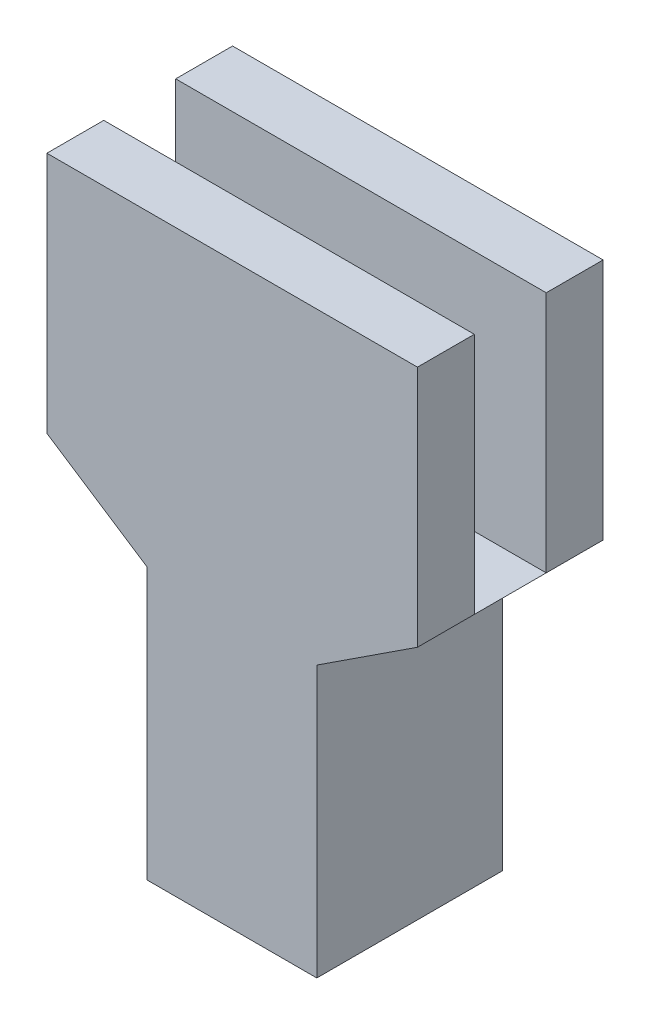
ISO-10303-21;
HEADER;
FILE_DESCRIPTION(('STEP AP214'),'2;1');
FILE_NAME('part.step','',(''),(''),'','','');
FILE_SCHEMA(('AUTOMOTIVE_DESIGN { 1 0 10303 214 1 1 1 1 }'));
ENDSEC;
DATA;
#1=APPLICATION_CONTEXT('core data for automotive mechanical design processes');
#2=APPLICATION_PROTOCOL_DEFINITION('international standard','automotive_design',2000,#1);
#3=PRODUCT_CONTEXT('',#1,'mechanical');
#4=PRODUCT('Part','Part','',(#3));
#5=PRODUCT_RELATED_PRODUCT_CATEGORY('part','',(#4));
#6=PRODUCT_DEFINITION_FORMATION('','',#4);
#7=PRODUCT_DEFINITION_CONTEXT('part definition',#1,'design');
#8=PRODUCT_DEFINITION('design','',#6,#7);
#9=PRODUCT_DEFINITION_SHAPE('','',#8);
#10=(LENGTH_UNIT() NAMED_UNIT(*) SI_UNIT(.MILLI.,.METRE.));
#11=(NAMED_UNIT(*) PLANE_ANGLE_UNIT() SI_UNIT($,.RADIAN.));
#12=(NAMED_UNIT(*) SI_UNIT($,.STERADIAN.) SOLID_ANGLE_UNIT());
#13=UNCERTAINTY_MEASURE_WITH_UNIT(LENGTH_MEASURE(1.E-05),#10,'distance_accuracy_value','');
#14=(GEOMETRIC_REPRESENTATION_CONTEXT(3) GLOBAL_UNCERTAINTY_ASSIGNED_CONTEXT((#13)) GLOBAL_UNIT_ASSIGNED_CONTEXT((#10,
#11,#12)) REPRESENTATION_CONTEXT('',''));
#15=CARTESIAN_POINT('',(0.,0.,0.));
#16=DIRECTION('',(0.,0.,1.));
#17=DIRECTION('',(1.,0.,0.));
#18=AXIS2_PLACEMENT_3D('',#15,#16,#17);
#19=CARTESIAN_POINT('',(49.8924699404346,106.450623348882,50.));
#20=DIRECTION('',(-1.,0.,0.));
#21=DIRECTION('',(0.,-1.,0.));
#22=AXIS2_PLACEMENT_3D('',#19,#20,#21);
#23=PLANE('',#22);
#24=DIRECTION('',(0.,0.,-1.));
#25=VECTOR('',#24,1.);
#26=CARTESIAN_POINT('',(49.8924699404346,41.1226560450599,50.));
#27=LINE('',#26,#25);
#28=CARTESIAN_POINT('',(49.8924699404346,41.1226560450599,50.));
#29=VERTEX_POINT('',#28);
#30=CARTESIAN_POINT('',(49.8924699404346,41.12265604506,34.6825403750302));
#31=VERTEX_POINT('',#30);
#32=EDGE_CURVE('E169',#29,#31,#27,.T.);
#33=ORIENTED_EDGE('',*,*,#32,.T.);
#34=DIRECTION('',(0.,1.,0.));
#35=VECTOR('',#34,1.);
#36=CARTESIAN_POINT('',(49.8924699404346,188.280019043169,34.6825403750302));
#37=LINE('',#36,#35);
#38=CARTESIAN_POINT('',(49.8924699404346,106.450623348882,34.6825403750302));
#39=VERTEX_POINT('',#38);
#40=EDGE_CURVE('E130',#31,#39,#37,.T.);
#41=ORIENTED_EDGE('',*,*,#40,.T.);
#42=DIRECTION('',(0.,0.,-1.));
#43=VECTOR('',#42,1.);
#44=CARTESIAN_POINT('',(49.8924699404346,106.450623348882,50.));
#45=LINE('',#44,#43);
#46=CARTESIAN_POINT('',(49.8924699404346,106.450623348882,50.));
#47=VERTEX_POINT('',#46);
#48=EDGE_CURVE('E128',#47,#39,#45,.T.);
#49=ORIENTED_EDGE('',*,*,#48,.F.);
#50=DIRECTION('',(0.,1.,0.));
#51=VECTOR('',#50,1.);
#52=CARTESIAN_POINT('',(49.8924699404346,106.450623348882,50.));
#53=LINE('',#52,#51);
#54=EDGE_CURVE('E114',#29,#47,#53,.T.);
#55=ORIENTED_EDGE('',*,*,#54,.F.);
#56=EDGE_LOOP('',(#33,#41,#49,#55));
#57=FACE_BOUND('',#56,.T.);
#58=ADVANCED_FACE('F33',(#57),#23,.F.);
#59=CARTESIAN_POINT('',(-49.8924699404346,106.450623348882,50.));
#60=DIRECTION('',(0.,-1.,0.));
#61=DIRECTION('',(1.,0.,0.));
#62=AXIS2_PLACEMENT_3D('',#59,#60,#61);
#63=PLANE('',#62);
#64=ORIENTED_EDGE('',*,*,#48,.T.);
#65=DIRECTION('',(-1.,0.,0.));
#66=VECTOR('',#65,1.);
#67=CARTESIAN_POINT('',(-49.8924699404346,106.450623348882,34.6825403750302));
#68=LINE('',#67,#66);
#69=CARTESIAN_POINT('',(-49.8924699404346,106.450623348882,34.6825403750302));
#70=VERTEX_POINT('',#69);
#71=EDGE_CURVE('E208',#39,#70,#68,.T.);
#72=ORIENTED_EDGE('',*,*,#71,.T.);
#73=DIRECTION('',(0.,0.,-1.));
#74=VECTOR('',#73,1.);
#75=CARTESIAN_POINT('',(-49.8924699404346,106.450623348882,50.));
#76=LINE('',#75,#74);
#77=CARTESIAN_POINT('',(-49.8924699404346,106.450623348882,50.));
#78=VERTEX_POINT('',#77);
#79=EDGE_CURVE('E138',#78,#70,#76,.T.);
#80=ORIENTED_EDGE('',*,*,#79,.F.);
#81=DIRECTION('',(-1.,0.,0.));
#82=VECTOR('',#81,1.);
#83=CARTESIAN_POINT('',(-49.8924699404346,106.450623348882,50.));
#84=LINE('',#83,#82);
#85=EDGE_CURVE('E118',#47,#78,#84,.T.);
#86=ORIENTED_EDGE('',*,*,#85,.F.);
#87=EDGE_LOOP('',(#64,#72,#80,#86));
#88=FACE_BOUND('',#87,.T.);
#89=ADVANCED_FACE('F136',(#88),#63,.F.);
#90=CARTESIAN_POINT('',(-49.8924699404346,106.450623348882,50.));
#91=DIRECTION('',(1.,0.,0.));
#92=DIRECTION('',(0.,1.,0.));
#93=AXIS2_PLACEMENT_3D('',#90,#91,#92);
#94=PLANE('',#93);
#95=ORIENTED_EDGE('',*,*,#79,.T.);
#96=DIRECTION('',(0.,1.,0.));
#97=VECTOR('',#96,1.);
#98=CARTESIAN_POINT('',(-49.8924699404346,188.280019043169,34.6825403750302));
#99=LINE('',#98,#97);
#100=CARTESIAN_POINT('',(-49.8924699404346,41.1226560450599,34.6825403750302));
#101=VERTEX_POINT('',#100);
#102=EDGE_CURVE('E223',#101,#70,#99,.T.);
#103=ORIENTED_EDGE('',*,*,#102,.F.);
#104=DIRECTION('',(0.,0.,-1.));
#105=VECTOR('',#104,1.);
#106=CARTESIAN_POINT('',(-49.8924699404346,41.1226560450599,50.));
#107=LINE('',#106,#105);
#108=CARTESIAN_POINT('',(-49.8924699404346,41.1226560450599,50.));
#109=VERTEX_POINT('',#108);
#110=EDGE_CURVE('E164',#109,#101,#107,.T.);
#111=ORIENTED_EDGE('',*,*,#110,.F.);
#112=DIRECTION('',(0.,-1.,0.));
#113=VECTOR('',#112,1.);
#114=CARTESIAN_POINT('',(-49.8924699404346,106.450623348882,50.));
#115=LINE('',#114,#113);
#116=EDGE_CURVE('E56',#78,#109,#115,.T.);
#117=ORIENTED_EDGE('',*,*,#116,.F.);
#118=EDGE_LOOP('',(#95,#103,#111,#117));
#119=FACE_BOUND('',#118,.T.);
#120=ADVANCED_FACE('F262',(#119),#94,.F.);
#121=CARTESIAN_POINT('',(-49.8924699404346,41.1226560450599,50.));
#122=DIRECTION('',(0.548213568553886,0.836338378441055,0.));
#123=DIRECTION('',(-0.836338378441055,0.548213568553887,0.));
#124=AXIS2_PLACEMENT_3D('',#121,#122,#123);
#125=PLANE('',#124);
#126=DIRECTION('',(0.836338378441055,-0.548213568553887,0.));
#127=VECTOR('',#126,1.);
#128=CARTESIAN_POINT('',(-49.8924699404346,41.1226560450599,0.));
#129=LINE('',#128,#127);
#130=CARTESIAN_POINT('',(-49.8924699404346,41.1226560450599,0.));
#131=VERTEX_POINT('',#130);
#132=CARTESIAN_POINT('',(-22.9108785051738,23.436424123527,0.));
#133=VERTEX_POINT('',#132);
#134=EDGE_CURVE('E143',#131,#133,#129,.T.);
#135=ORIENTED_EDGE('',*,*,#134,.T.);
#136=DIRECTION('',(0.,0.,-1.));
#137=VECTOR('',#136,1.);
#138=CARTESIAN_POINT('',(-22.9108785051738,23.436424123527,50.));
#139=LINE('',#138,#137);
#140=CARTESIAN_POINT('',(-22.9108785051738,23.436424123527,50.));
#141=VERTEX_POINT('',#140);
#142=EDGE_CURVE('E41',#141,#133,#139,.T.);
#143=ORIENTED_EDGE('',*,*,#142,.F.);
#144=DIRECTION('',(0.836338378441055,-0.548213568553887,0.));
#145=VECTOR('',#144,1.);
#146=CARTESIAN_POINT('',(-49.8924699404346,41.1226560450599,50.));
#147=LINE('',#146,#145);
#148=EDGE_CURVE('E163',#109,#141,#147,.T.);
#149=ORIENTED_EDGE('',*,*,#148,.F.);
#150=ORIENTED_EDGE('',*,*,#110,.T.);
#151=DIRECTION('',(0.,0.,1.));
#152=VECTOR('',#151,1.);
#153=CARTESIAN_POINT('',(-49.8924699404346,41.1226560450599,15.3174596249698));
#154=LINE('',#153,#152);
#155=CARTESIAN_POINT('',(-49.8924699404346,41.1226560450599,15.3174596249698));
#156=VERTEX_POINT('',#155);
#157=EDGE_CURVE('E220',#156,#101,#154,.T.);
#158=ORIENTED_EDGE('',*,*,#157,.F.);
#159=EDGE_CURVE('E90',#156,#131,#107,.T.);
#160=ORIENTED_EDGE('',*,*,#159,.T.);
#161=EDGE_LOOP('',(#135,#143,#149,#150,#158,#160));
#162=FACE_BOUND('',#161,.T.);
#163=ADVANCED_FACE('F35',(#162),#125,.F.);
#164=CARTESIAN_POINT('',(-22.9108785051738,23.436424123527,50.));
#165=DIRECTION('',(1.,0.,0.));
#166=DIRECTION('',(0.,1.,0.));
#167=AXIS2_PLACEMENT_3D('',#164,#165,#166);
#168=PLANE('',#167);
#169=DIRECTION('',(0.,-1.,0.));
#170=VECTOR('',#169,1.);
#171=CARTESIAN_POINT('',(-22.9108785051738,23.436424123527,0.));
#172=LINE('',#171,#170);
#173=CARTESIAN_POINT('',(-22.9108785051738,-49.5635692266299,0.));
#174=VERTEX_POINT('',#173);
#175=EDGE_CURVE('E145',#133,#174,#172,.T.);
#176=ORIENTED_EDGE('',*,*,#175,.T.);
#177=DIRECTION('',(0.,0.,-1.));
#178=VECTOR('',#177,1.);
#179=CARTESIAN_POINT('',(-22.9108785051738,-49.5635692266299,50.));
#180=LINE('',#179,#178);
#181=CARTESIAN_POINT('',(-22.9108785051738,-49.5635692266299,50.));
#182=VERTEX_POINT('',#181);
#183=EDGE_CURVE('E177',#182,#174,#180,.T.);
#184=ORIENTED_EDGE('',*,*,#183,.F.);
#185=DIRECTION('',(0.,-1.,0.));
#186=VECTOR('',#185,1.);
#187=CARTESIAN_POINT('',(-22.9108785051738,23.436424123527,50.));
#188=LINE('',#187,#186);
#189=EDGE_CURVE('E99',#141,#182,#188,.T.);
#190=ORIENTED_EDGE('',*,*,#189,.F.);
#191=ORIENTED_EDGE('',*,*,#142,.T.);
#192=EDGE_LOOP('',(#176,#184,#190,#191));
#193=FACE_BOUND('',#192,.T.);
#194=ADVANCED_FACE('F180',(#193),#168,.F.);
#195=CARTESIAN_POINT('',(-22.9108785051738,-49.5635692266299,50.));
#196=DIRECTION('',(0.,1.,0.));
#197=DIRECTION('',(0.,0.,1.));
#198=AXIS2_PLACEMENT_3D('',#195,#196,#197);
#199=PLANE('',#198);
#200=CARTESIAN_POINT('',(0.,-49.5635692266299,25.));
#201=DIRECTION('',(0.,-1.,0.));
#202=DIRECTION('',(0.,0.,-1.));
#203=AXIS2_PLACEMENT_3D('',#200,#201,#202);
#204=CIRCLE('',#203,5.);
#205=CARTESIAN_POINT('',(0.,-49.5635692266299,20.));
#206=VERTEX_POINT('',#205);
#207=EDGE_CURVE('E205',#206,#206,#204,.T.);
#208=ORIENTED_EDGE('',*,*,#207,.F.);
#209=EDGE_LOOP('',(#208));
#210=FACE_BOUND('',#209,.T.);
#211=DIRECTION('',(1.,0.,0.));
#212=VECTOR('',#211,1.);
#213=CARTESIAN_POINT('',(-22.9108785051738,-49.5635692266299,0.));
#214=LINE('',#213,#212);
#215=CARTESIAN_POINT('',(22.7929745442098,-49.5635692266299,0.));
#216=VERTEX_POINT('',#215);
#217=EDGE_CURVE('E148',#174,#216,#214,.T.);
#218=ORIENTED_EDGE('',*,*,#217,.T.);
#219=DIRECTION('',(0.,0.,-1.));
#220=VECTOR('',#219,1.);
#221=CARTESIAN_POINT('',(22.7929745442098,-49.5635692266299,50.));
#222=LINE('',#221,#220);
#223=CARTESIAN_POINT('',(22.7929745442098,-49.5635692266299,50.));
#224=VERTEX_POINT('',#223);
#225=EDGE_CURVE('E174',#224,#216,#222,.T.);
#226=ORIENTED_EDGE('',*,*,#225,.F.);
#227=DIRECTION('',(1.,0.,0.));
#228=VECTOR('',#227,1.);
#229=CARTESIAN_POINT('',(-22.9108785051738,-49.5635692266299,50.));
#230=LINE('',#229,#228);
#231=EDGE_CURVE('E199',#182,#224,#230,.T.);
#232=ORIENTED_EDGE('',*,*,#231,.F.);
#233=ORIENTED_EDGE('',*,*,#183,.T.);
#234=EDGE_LOOP('',(#218,#226,#232,#233));
#235=FACE_BOUND('',#234,.T.);
#236=ADVANCED_FACE('F192',(#210,#235),#199,.F.);
#237=CARTESIAN_POINT('',(22.824133964806,23.4364241233047,50.));
#238=DIRECTION('',(-0.999999908903215,0.000426841378029894,0.));
#239=DIRECTION('',(-0.000426841378029894,-0.999999908903215,0.));
#240=AXIS2_PLACEMENT_3D('',#237,#238,#239);
#241=PLANE('',#240);
#242=DIRECTION('',(0.000426841378029894,0.999999908903215,0.));
#243=VECTOR('',#242,1.);
#244=CARTESIAN_POINT('',(22.824133964806,23.4364241233047,0.));
#245=LINE('',#244,#243);
#246=CARTESIAN_POINT('',(22.824133964806,23.4364241233047,0.));
#247=VERTEX_POINT('',#246);
#248=EDGE_CURVE('E150',#216,#247,#245,.T.);
#249=ORIENTED_EDGE('',*,*,#248,.T.);
#250=DIRECTION('',(0.,0.,-1.));
#251=VECTOR('',#250,1.);
#252=CARTESIAN_POINT('',(22.824133964806,23.4364241233047,50.));
#253=LINE('',#252,#251);
#254=CARTESIAN_POINT('',(22.824133964806,23.4364241233047,50.));
#255=VERTEX_POINT('',#254);
#256=EDGE_CURVE('E171',#255,#247,#253,.T.);
#257=ORIENTED_EDGE('',*,*,#256,.F.);
#258=DIRECTION('',(0.000426841378029894,0.999999908903215,0.));
#259=VECTOR('',#258,1.);
#260=CARTESIAN_POINT('',(22.824133964806,23.4364241233047,50.));
#261=LINE('',#260,#259);
#262=EDGE_CURVE('E198',#224,#255,#261,.T.);
#263=ORIENTED_EDGE('',*,*,#262,.F.);
#264=ORIENTED_EDGE('',*,*,#225,.T.);
#265=EDGE_LOOP('',(#249,#257,#263,#264));
#266=FACE_BOUND('',#265,.T.);
#267=ADVANCED_FACE('F196',(#266),#241,.F.);
#268=CARTESIAN_POINT('',(49.8924699404346,41.1226560450599,50.));
#269=DIRECTION('',(-0.54698295491962,0.837143743348418,0.));
#270=DIRECTION('',(-0.837143743348418,-0.54698295491962,0.));
#271=AXIS2_PLACEMENT_3D('',#268,#269,#270);
#272=PLANE('',#271);
#273=DIRECTION('',(0.837143743348418,0.54698295491962,0.));
#274=VECTOR('',#273,1.);
#275=CARTESIAN_POINT('',(49.8924699404346,41.1226560450599,0.));
#276=LINE('',#275,#274);
#277=CARTESIAN_POINT('',(49.8924699404346,41.1226560450599,0.));
#278=VERTEX_POINT('',#277);
#279=EDGE_CURVE('E152',#247,#278,#276,.T.);
#280=ORIENTED_EDGE('',*,*,#279,.T.);
#281=CARTESIAN_POINT('',(49.8924699404346,41.12265604506,15.3174596249698));
#282=VERTEX_POINT('',#281);
#283=EDGE_CURVE('E133',#282,#278,#27,.T.);
#284=ORIENTED_EDGE('',*,*,#283,.F.);
#285=DIRECTION('',(0.,0.,1.));
#286=VECTOR('',#285,1.);
#287=CARTESIAN_POINT('',(49.8924699404346,41.12265604506,15.3174596249698));
#288=LINE('',#287,#286);
#289=EDGE_CURVE('E217',#282,#31,#288,.T.);
#290=ORIENTED_EDGE('',*,*,#289,.T.);
#291=ORIENTED_EDGE('',*,*,#32,.F.);
#292=DIRECTION('',(0.837143743348418,0.54698295491962,0.));
#293=VECTOR('',#292,1.);
#294=CARTESIAN_POINT('',(49.8924699404346,41.1226560450599,50.));
#295=LINE('',#294,#293);
#296=EDGE_CURVE('E121',#255,#29,#295,.T.);
#297=ORIENTED_EDGE('',*,*,#296,.F.);
#298=ORIENTED_EDGE('',*,*,#256,.T.);
#299=EDGE_LOOP('',(#280,#284,#290,#291,#297,#298));
#300=FACE_BOUND('',#299,.T.);
#301=ADVANCED_FACE('F242',(#300),#272,.F.);
#302=CARTESIAN_POINT('',(49.8924699404346,106.450623348882,15.3174596249698));
#303=VERTEX_POINT('',#302);
#304=CARTESIAN_POINT('',(49.8924699404346,106.450623348882,0.));
#305=VERTEX_POINT('',#304);
#306=EDGE_CURVE('E134',#303,#305,#45,.T.);
#307=ORIENTED_EDGE('',*,*,#306,.F.);
#308=DIRECTION('',(0.,-1.,0.));
#309=VECTOR('',#308,1.);
#310=CARTESIAN_POINT('',(49.8924699404346,188.280019043169,15.3174596249698));
#311=LINE('',#310,#309);
#312=EDGE_CURVE('E228',#303,#282,#311,.T.);
#313=ORIENTED_EDGE('',*,*,#312,.T.);
#314=ORIENTED_EDGE('',*,*,#283,.T.);
#315=DIRECTION('',(0.,1.,0.));
#316=VECTOR('',#315,1.);
#317=CARTESIAN_POINT('',(49.8924699404346,106.450623348882,0.));
#318=LINE('',#317,#316);
#319=EDGE_CURVE('E155',#278,#305,#318,.T.);
#320=ORIENTED_EDGE('',*,*,#319,.T.);
#321=EDGE_LOOP('',(#307,#313,#314,#320));
#322=FACE_BOUND('',#321,.T.);
#323=ADVANCED_FACE('F235',(#322),#23,.F.);
#324=CARTESIAN_POINT('',(-49.8924699404346,106.450623348882,15.3174596249698));
#325=VERTEX_POINT('',#324);
#326=CARTESIAN_POINT('',(-49.8924699404346,106.450623348882,0.));
#327=VERTEX_POINT('',#326);
#328=EDGE_CURVE('E167',#325,#327,#76,.T.);
#329=ORIENTED_EDGE('',*,*,#328,.F.);
#330=DIRECTION('',(1.,0.,0.));
#331=VECTOR('',#330,1.);
#332=CARTESIAN_POINT('',(-49.8924699404346,106.450623348882,15.3174596249698));
#333=LINE('',#332,#331);
#334=EDGE_CURVE('E48',#325,#303,#333,.T.);
#335=ORIENTED_EDGE('',*,*,#334,.T.);
#336=ORIENTED_EDGE('',*,*,#306,.T.);
#337=DIRECTION('',(-1.,0.,0.));
#338=VECTOR('',#337,1.);
#339=CARTESIAN_POINT('',(-49.8924699404346,106.450623348882,0.));
#340=LINE('',#339,#338);
#341=EDGE_CURVE('E158',#305,#327,#340,.T.);
#342=ORIENTED_EDGE('',*,*,#341,.T.);
#343=EDGE_LOOP('',(#329,#335,#336,#342));
#344=FACE_BOUND('',#343,.T.);
#345=ADVANCED_FACE('F247',(#344),#63,.F.);
#346=ORIENTED_EDGE('',*,*,#159,.F.);
#347=DIRECTION('',(0.,1.,0.));
#348=VECTOR('',#347,1.);
#349=CARTESIAN_POINT('',(-49.8924699404346,106.450623348882,15.3174596249698));
#350=LINE('',#349,#348);
#351=EDGE_CURVE('E11',#156,#325,#350,.T.);
#352=ORIENTED_EDGE('',*,*,#351,.T.);
#353=ORIENTED_EDGE('',*,*,#328,.T.);
#354=DIRECTION('',(0.,-1.,0.));
#355=VECTOR('',#354,1.);
#356=CARTESIAN_POINT('',(-49.8924699404346,106.450623348882,0.));
#357=LINE('',#356,#355);
#358=EDGE_CURVE('E161',#327,#131,#357,.T.);
#359=ORIENTED_EDGE('',*,*,#358,.T.);
#360=EDGE_LOOP('',(#346,#352,#353,#359));
#361=FACE_BOUND('',#360,.T.);
#362=ADVANCED_FACE('F260',(#361),#94,.F.);
#363=CARTESIAN_POINT('',(-0.0800722510311269,8.47100092618879,50.));
#364=DIRECTION('',(0.,0.,-1.));
#365=DIRECTION('',(-1.,0.,0.));
#366=AXIS2_PLACEMENT_3D('',#363,#364,#365);
#367=PLANE('',#366);
#368=ORIENTED_EDGE('',*,*,#148,.T.);
#369=ORIENTED_EDGE('',*,*,#189,.T.);
#370=ORIENTED_EDGE('',*,*,#231,.T.);
#371=ORIENTED_EDGE('',*,*,#262,.T.);
#372=ORIENTED_EDGE('',*,*,#296,.T.);
#373=ORIENTED_EDGE('',*,*,#54,.T.);
#374=ORIENTED_EDGE('',*,*,#85,.T.);
#375=ORIENTED_EDGE('',*,*,#116,.T.);
#376=EDGE_LOOP('',(#368,#369,#370,#371,#372,#373,#374,#375));
#377=FACE_BOUND('',#376,.T.);
#378=ADVANCED_FACE('F116',(#377),#367,.F.);
#379=CARTESIAN_POINT('',(-0.0800722510311269,8.47100092618879,0.));
#380=DIRECTION('',(0.,0.,-1.));
#381=DIRECTION('',(-1.,0.,0.));
#382=AXIS2_PLACEMENT_3D('',#379,#380,#381);
#383=PLANE('',#382);
#384=ORIENTED_EDGE('',*,*,#134,.F.);
#385=ORIENTED_EDGE('',*,*,#358,.F.);
#386=ORIENTED_EDGE('',*,*,#341,.F.);
#387=ORIENTED_EDGE('',*,*,#319,.F.);
#388=ORIENTED_EDGE('',*,*,#279,.F.);
#389=ORIENTED_EDGE('',*,*,#248,.F.);
#390=ORIENTED_EDGE('',*,*,#217,.F.);
#391=ORIENTED_EDGE('',*,*,#175,.F.);
#392=EDGE_LOOP('',(#384,#385,#386,#387,#388,#389,#390,#391));
#393=FACE_BOUND('',#392,.T.);
#394=ADVANCED_FACE('F185',(#393),#383,.T.);
#395=CARTESIAN_POINT('',(0.,-29.5635692266299,25.));
#396=DIRECTION('',(0.,-1.,0.));
#397=DIRECTION('',(0.,0.,-1.));
#398=AXIS2_PLACEMENT_3D('',#395,#396,#397);
#399=CYLINDRICAL_SURFACE('',#398,5.);
#400=CARTESIAN_POINT('',(0.,-29.5635692266299,25.));
#401=DIRECTION('',(0.,-1.,0.));
#402=DIRECTION('',(0.,0.,-1.));
#403=AXIS2_PLACEMENT_3D('',#400,#401,#402);
#404=CIRCLE('',#403,5.);
#405=CARTESIAN_POINT('',(0.,-29.5635692266299,20.));
#406=VERTEX_POINT('',#405);
#407=EDGE_CURVE('E146',#406,#406,#404,.T.);
#408=ORIENTED_EDGE('',*,*,#407,.F.);
#409=EDGE_LOOP('',(#408));
#410=FACE_BOUND('',#409,.T.);
#411=ORIENTED_EDGE('',*,*,#207,.T.);
#412=EDGE_LOOP('',(#411));
#413=FACE_BOUND('',#412,.T.);
#414=ADVANCED_FACE('F274',(#410,#413),#399,.F.);
#415=CARTESIAN_POINT('',(0.,-29.5635692266299,25.));
#416=DIRECTION('',(0.,-1.,0.));
#417=DIRECTION('',(0.,0.,-1.));
#418=AXIS2_PLACEMENT_3D('',#415,#416,#417);
#419=PLANE('',#418);
#420=ORIENTED_EDGE('',*,*,#407,.T.);
#421=EDGE_LOOP('',(#420));
#422=FACE_BOUND('',#421,.T.);
#423=ADVANCED_FACE('F267',(#422),#419,.T.);
#424=CARTESIAN_POINT('',(49.8924699404346,188.280019043169,34.6825403750302));
#425=DIRECTION('',(0.,0.,1.));
#426=DIRECTION('',(1.,0.,0.));
#427=AXIS2_PLACEMENT_3D('',#424,#425,#426);
#428=PLANE('',#427);
#429=ORIENTED_EDGE('',*,*,#40,.F.);
#430=DIRECTION('',(-1.,0.,0.));
#431=VECTOR('',#430,1.);
#432=CARTESIAN_POINT('',(49.8924699404346,41.12265604506,34.6825403750302));
#433=LINE('',#432,#431);
#434=EDGE_CURVE('E213',#31,#101,#433,.T.);
#435=ORIENTED_EDGE('',*,*,#434,.T.);
#436=ORIENTED_EDGE('',*,*,#102,.T.);
#437=ORIENTED_EDGE('',*,*,#71,.F.);
#438=EDGE_LOOP('',(#429,#435,#436,#437));
#439=FACE_BOUND('',#438,.T.);
#440=ADVANCED_FACE('F265',(#439),#428,.F.);
#441=CARTESIAN_POINT('',(49.8924699404346,188.280019043169,15.3174596249698));
#442=DIRECTION('',(0.,0.,-1.));
#443=DIRECTION('',(-1.,0.,0.));
#444=AXIS2_PLACEMENT_3D('',#441,#442,#443);
#445=PLANE('',#444);
#446=ORIENTED_EDGE('',*,*,#351,.F.);
#447=DIRECTION('',(-1.,0.,0.));
#448=VECTOR('',#447,1.);
#449=CARTESIAN_POINT('',(49.8924699404346,41.12265604506,15.3174596249698));
#450=LINE('',#449,#448);
#451=EDGE_CURVE('E214',#282,#156,#450,.T.);
#452=ORIENTED_EDGE('',*,*,#451,.F.);
#453=ORIENTED_EDGE('',*,*,#312,.F.);
#454=ORIENTED_EDGE('',*,*,#334,.F.);
#455=EDGE_LOOP('',(#446,#452,#453,#454));
#456=FACE_BOUND('',#455,.T.);
#457=ADVANCED_FACE('F255',(#456),#445,.F.);
#458=CARTESIAN_POINT('',(49.8924699404346,41.12265604506,15.3174596249698));
#459=DIRECTION('',(0.,-1.,0.));
#460=DIRECTION('',(1.,0.,0.));
#461=AXIS2_PLACEMENT_3D('',#458,#459,#460);
#462=PLANE('',#461);
#463=ORIENTED_EDGE('',*,*,#157,.T.);
#464=ORIENTED_EDGE('',*,*,#434,.F.);
#465=ORIENTED_EDGE('',*,*,#289,.F.);
#466=ORIENTED_EDGE('',*,*,#451,.T.);
#467=EDGE_LOOP('',(#463,#464,#465,#466));
#468=FACE_BOUND('',#467,.T.);
#469=ADVANCED_FACE('F258',(#468),#462,.F.);
#470=CLOSED_SHELL('',(#58,#89,#120,#163,#194,#236,#267,#301,#323,#345,#362,#378,#394,#414,#423,
#440,#457,#469));
#471=MANIFOLD_SOLID_BREP('B2',#470);
#472=ADVANCED_BREP_SHAPE_REPRESENTATION('',(#18,#471),#14);
#473=SHAPE_DEFINITION_REPRESENTATION(#9,#472);
ENDSEC;
END-ISO-10303-21;
